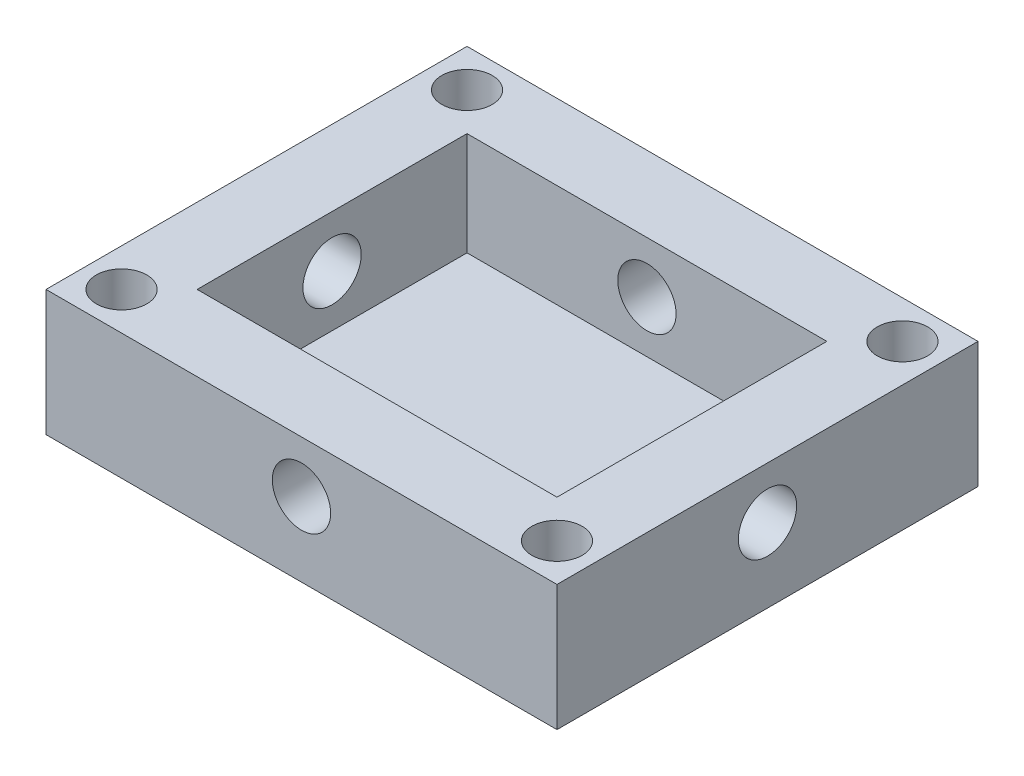
ISO-10303-21;
HEADER;
FILE_DESCRIPTION(('STEP AP214'),'2;1');
FILE_NAME('part.step','',(''),(''),'','','');
FILE_SCHEMA(('AUTOMOTIVE_DESIGN { 1 0 10303 214 1 1 1 1 }'));
ENDSEC;
DATA;
#1=APPLICATION_CONTEXT('core data for automotive mechanical design processes');
#2=APPLICATION_PROTOCOL_DEFINITION('international standard','automotive_design',2000,#1);
#3=PRODUCT_CONTEXT('',#1,'mechanical');
#4=PRODUCT('Part','Part','',(#3));
#5=PRODUCT_RELATED_PRODUCT_CATEGORY('part','',(#4));
#6=PRODUCT_DEFINITION_FORMATION('','',#4);
#7=PRODUCT_DEFINITION_CONTEXT('part definition',#1,'design');
#8=PRODUCT_DEFINITION('design','',#6,#7);
#9=PRODUCT_DEFINITION_SHAPE('','',#8);
#10=(LENGTH_UNIT() NAMED_UNIT(*) SI_UNIT(.MILLI.,.METRE.));
#11=(NAMED_UNIT(*) PLANE_ANGLE_UNIT() SI_UNIT($,.RADIAN.));
#12=(NAMED_UNIT(*) SI_UNIT($,.STERADIAN.) SOLID_ANGLE_UNIT());
#13=UNCERTAINTY_MEASURE_WITH_UNIT(LENGTH_MEASURE(1.E-05),#10,'distance_accuracy_value','');
#14=(GEOMETRIC_REPRESENTATION_CONTEXT(3) GLOBAL_UNCERTAINTY_ASSIGNED_CONTEXT((#13)) GLOBAL_UNIT_ASSIGNED_CONTEXT((#10,
#11,#12)) REPRESENTATION_CONTEXT('',''));
#15=CARTESIAN_POINT('',(0.,0.,0.));
#16=DIRECTION('',(0.,0.,1.));
#17=DIRECTION('',(1.,0.,0.));
#18=AXIS2_PLACEMENT_3D('',#15,#16,#17);
#19=CARTESIAN_POINT('',(0.,7.2898,0.));
#20=DIRECTION('',(0.,-1.,0.));
#21=DIRECTION('',(0.,0.,-1.));
#22=AXIS2_PLACEMENT_3D('',#19,#20,#21);
#23=PLANE('',#22);
#24=CARTESIAN_POINT('',(-15.367,7.2898,12.192));
#25=DIRECTION('',(0.,1.,0.));
#26=DIRECTION('',(0.,0.,1.));
#27=AXIS2_PLACEMENT_3D('',#24,#25,#26);
#28=CIRCLE('',#27,1.778);
#29=CARTESIAN_POINT('',(-15.367,7.2898,13.97));
#30=VERTEX_POINT('',#29);
#31=EDGE_CURVE('E198',#30,#30,#28,.T.);
#32=ORIENTED_EDGE('',*,*,#31,.F.);
#33=EDGE_LOOP('',(#32));
#34=FACE_BOUND('',#33,.T.);
#35=CARTESIAN_POINT('',(15.367,7.2898,12.192));
#36=DIRECTION('',(0.,1.,0.));
#37=DIRECTION('',(0.,0.,1.));
#38=AXIS2_PLACEMENT_3D('',#35,#36,#37);
#39=CIRCLE('',#38,1.778);
#40=CARTESIAN_POINT('',(15.367,7.2898,13.97));
#41=VERTEX_POINT('',#40);
#42=EDGE_CURVE('E202',#41,#41,#39,.T.);
#43=ORIENTED_EDGE('',*,*,#42,.F.);
#44=EDGE_LOOP('',(#43));
#45=FACE_BOUND('',#44,.T.);
#46=CARTESIAN_POINT('',(15.367,7.2898,-12.192));
#47=DIRECTION('',(0.,1.,0.));
#48=DIRECTION('',(0.,0.,1.));
#49=AXIS2_PLACEMENT_3D('',#46,#47,#48);
#50=CIRCLE('',#49,1.778);
#51=CARTESIAN_POINT('',(15.367,7.2898,-10.414));
#52=VERTEX_POINT('',#51);
#53=EDGE_CURVE('E199',#52,#52,#50,.T.);
#54=ORIENTED_EDGE('',*,*,#53,.F.);
#55=EDGE_LOOP('',(#54));
#56=FACE_BOUND('',#55,.T.);
#57=CARTESIAN_POINT('',(-15.367,7.2898,-12.192));
#58=DIRECTION('',(0.,1.,0.));
#59=DIRECTION('',(0.,0.,1.));
#60=AXIS2_PLACEMENT_3D('',#57,#58,#59);
#61=CIRCLE('',#60,1.778);
#62=CARTESIAN_POINT('',(-15.367,7.2898,-10.414));
#63=VERTEX_POINT('',#62);
#64=EDGE_CURVE('E130',#63,#63,#61,.T.);
#65=ORIENTED_EDGE('',*,*,#64,.F.);
#66=EDGE_LOOP('',(#65));
#67=FACE_BOUND('',#66,.T.);
#68=DIRECTION('',(0.,0.,1.));
#69=VECTOR('',#68,1.);
#70=CARTESIAN_POINT('',(-18.034,7.2898,14.859));
#71=LINE('',#70,#69);
#72=CARTESIAN_POINT('',(-18.034,7.2898,-14.859));
#73=VERTEX_POINT('',#72);
#74=CARTESIAN_POINT('',(-18.034,7.2898,14.859));
#75=VERTEX_POINT('',#74);
#76=EDGE_CURVE('E160',#73,#75,#71,.T.);
#77=ORIENTED_EDGE('',*,*,#76,.T.);
#78=DIRECTION('',(1.,0.,0.));
#79=VECTOR('',#78,1.);
#80=CARTESIAN_POINT('',(-18.034,7.2898,14.859));
#81=LINE('',#80,#79);
#82=CARTESIAN_POINT('',(18.034,7.2898,14.859));
#83=VERTEX_POINT('',#82);
#84=EDGE_CURVE('E163',#75,#83,#81,.T.);
#85=ORIENTED_EDGE('',*,*,#84,.T.);
#86=DIRECTION('',(0.,0.,-1.));
#87=VECTOR('',#86,1.);
#88=CARTESIAN_POINT('',(18.034,7.2898,14.859));
#89=LINE('',#88,#87);
#90=CARTESIAN_POINT('',(18.034,7.2898,-14.859));
#91=VERTEX_POINT('',#90);
#92=EDGE_CURVE('E107',#83,#91,#89,.T.);
#93=ORIENTED_EDGE('',*,*,#92,.T.);
#94=DIRECTION('',(-1.,0.,0.));
#95=VECTOR('',#94,1.);
#96=CARTESIAN_POINT('',(-18.034,7.2898,-14.859));
#97=LINE('',#96,#95);
#98=EDGE_CURVE('E166',#91,#73,#97,.T.);
#99=ORIENTED_EDGE('',*,*,#98,.T.);
#100=EDGE_LOOP('',(#77,#85,#93,#99));
#101=FACE_BOUND('',#100,.T.);
#102=DIRECTION('',(0.,0.,-1.));
#103=VECTOR('',#102,1.);
#104=CARTESIAN_POINT('',(12.7,7.2898,9.525));
#105=LINE('',#104,#103);
#106=CARTESIAN_POINT('',(12.7,7.2898,9.525));
#107=VERTEX_POINT('',#106);
#108=CARTESIAN_POINT('',(12.7,7.2898,-9.525));
#109=VERTEX_POINT('',#108);
#110=EDGE_CURVE('E135',#107,#109,#105,.T.);
#111=ORIENTED_EDGE('',*,*,#110,.F.);
#112=DIRECTION('',(1.,0.,0.));
#113=VECTOR('',#112,1.);
#114=CARTESIAN_POINT('',(-12.7,7.2898,9.525));
#115=LINE('',#114,#113);
#116=CARTESIAN_POINT('',(-12.7,7.2898,9.525));
#117=VERTEX_POINT('',#116);
#118=EDGE_CURVE('E142',#117,#107,#115,.T.);
#119=ORIENTED_EDGE('',*,*,#118,.F.);
#120=DIRECTION('',(0.,0.,1.));
#121=VECTOR('',#120,1.);
#122=CARTESIAN_POINT('',(-12.7,7.2898,9.525));
#123=LINE('',#122,#121);
#124=CARTESIAN_POINT('',(-12.7,7.2898,-9.525));
#125=VERTEX_POINT('',#124);
#126=EDGE_CURVE('E140',#125,#117,#123,.T.);
#127=ORIENTED_EDGE('',*,*,#126,.F.);
#128=DIRECTION('',(-1.,0.,0.));
#129=VECTOR('',#128,1.);
#130=CARTESIAN_POINT('',(-12.7,7.2898,-9.525));
#131=LINE('',#130,#129);
#132=EDGE_CURVE('E137',#109,#125,#131,.T.);
#133=ORIENTED_EDGE('',*,*,#132,.F.);
#134=EDGE_LOOP('',(#111,#119,#127,#133));
#135=FACE_BOUND('',#134,.T.);
#136=ADVANCED_FACE('F33',(#34,#45,#56,#67,#101,#135),#23,.F.);
#137=CARTESIAN_POINT('',(-18.034,7.2898,14.859));
#138=DIRECTION('',(1.,0.,0.));
#139=DIRECTION('',(0.,0.,-1.));
#140=AXIS2_PLACEMENT_3D('',#137,#138,#139);
#141=PLANE('',#140);
#142=CARTESIAN_POINT('',(-18.034,3.6449,0.));
#143=DIRECTION('',(1.,0.,0.));
#144=DIRECTION('',(0.,0.,-1.));
#145=AXIS2_PLACEMENT_3D('',#142,#143,#144);
#146=CIRCLE('',#145,2.0574);
#147=CARTESIAN_POINT('',(-18.034,3.6449,-2.0574));
#148=VERTEX_POINT('',#147);
#149=EDGE_CURVE('E181',#148,#148,#146,.T.);
#150=ORIENTED_EDGE('',*,*,#149,.T.);
#151=EDGE_LOOP('',(#150));
#152=FACE_BOUND('',#151,.T.);
#153=DIRECTION('',(0.,-1.,0.));
#154=VECTOR('',#153,1.);
#155=CARTESIAN_POINT('',(-18.034,7.2898,-14.859));
#156=LINE('',#155,#154);
#157=CARTESIAN_POINT('',(-18.034,-1.5875,-14.859));
#158=VERTEX_POINT('',#157);
#159=EDGE_CURVE('E168',#73,#158,#156,.T.);
#160=ORIENTED_EDGE('',*,*,#159,.T.);
#161=DIRECTION('',(0.,0.,-1.));
#162=VECTOR('',#161,1.);
#163=CARTESIAN_POINT('',(-18.034,-1.5875,-14.859));
#164=LINE('',#163,#162);
#165=CARTESIAN_POINT('',(-18.034,-1.5875,14.859));
#166=VERTEX_POINT('',#165);
#167=EDGE_CURVE('E118',#166,#158,#164,.T.);
#168=ORIENTED_EDGE('',*,*,#167,.F.);
#169=DIRECTION('',(0.,-1.,0.));
#170=VECTOR('',#169,1.);
#171=CARTESIAN_POINT('',(-18.034,7.2898,14.859));
#172=LINE('',#171,#170);
#173=EDGE_CURVE('E11',#75,#166,#172,.T.);
#174=ORIENTED_EDGE('',*,*,#173,.F.);
#175=ORIENTED_EDGE('',*,*,#76,.F.);
#176=EDGE_LOOP('',(#160,#168,#174,#175));
#177=FACE_BOUND('',#176,.T.);
#178=ADVANCED_FACE('F35',(#152,#177),#141,.F.);
#179=CARTESIAN_POINT('',(-18.034,7.2898,14.859));
#180=DIRECTION('',(0.,0.,-1.));
#181=DIRECTION('',(-1.,0.,0.));
#182=AXIS2_PLACEMENT_3D('',#179,#180,#181);
#183=PLANE('',#182);
#184=CARTESIAN_POINT('',(0.,3.6449,14.859));
#185=DIRECTION('',(0.,0.,1.));
#186=DIRECTION('',(1.,0.,0.));
#187=AXIS2_PLACEMENT_3D('',#184,#185,#186);
#188=CIRCLE('',#187,2.0574);
#189=CARTESIAN_POINT('',(2.0574,3.6449,14.859));
#190=VERTEX_POINT('',#189);
#191=EDGE_CURVE('E266',#190,#190,#188,.T.);
#192=ORIENTED_EDGE('',*,*,#191,.F.);
#193=EDGE_LOOP('',(#192));
#194=FACE_BOUND('',#193,.T.);
#195=ORIENTED_EDGE('',*,*,#173,.T.);
#196=DIRECTION('',(-1.,0.,0.));
#197=VECTOR('',#196,1.);
#198=CARTESIAN_POINT('',(-18.034,-1.5875,14.859));
#199=LINE('',#198,#197);
#200=CARTESIAN_POINT('',(18.034,-1.5875,14.859));
#201=VERTEX_POINT('',#200);
#202=EDGE_CURVE('E112',#201,#166,#199,.T.);
#203=ORIENTED_EDGE('',*,*,#202,.F.);
#204=DIRECTION('',(0.,-1.,0.));
#205=VECTOR('',#204,1.);
#206=CARTESIAN_POINT('',(18.034,7.2898,14.859));
#207=LINE('',#206,#205);
#208=EDGE_CURVE('E42',#83,#201,#207,.T.);
#209=ORIENTED_EDGE('',*,*,#208,.F.);
#210=ORIENTED_EDGE('',*,*,#84,.F.);
#211=EDGE_LOOP('',(#195,#203,#209,#210));
#212=FACE_BOUND('',#211,.T.);
#213=ADVANCED_FACE('F113',(#194,#212),#183,.F.);
#214=CARTESIAN_POINT('',(18.034,7.2898,14.859));
#215=DIRECTION('',(-1.,0.,0.));
#216=DIRECTION('',(0.,0.,1.));
#217=AXIS2_PLACEMENT_3D('',#214,#215,#216);
#218=PLANE('',#217);
#219=CARTESIAN_POINT('',(18.034,3.6449,0.));
#220=DIRECTION('',(-1.,0.,0.));
#221=DIRECTION('',(0.,0.,1.));
#222=AXIS2_PLACEMENT_3D('',#219,#220,#221);
#223=CIRCLE('',#222,2.0574);
#224=CARTESIAN_POINT('',(18.034,3.6449,2.0574));
#225=VERTEX_POINT('',#224);
#226=EDGE_CURVE('E185',#225,#225,#223,.T.);
#227=ORIENTED_EDGE('',*,*,#226,.T.);
#228=EDGE_LOOP('',(#227));
#229=FACE_BOUND('',#228,.T.);
#230=ORIENTED_EDGE('',*,*,#208,.T.);
#231=DIRECTION('',(0.,0.,1.));
#232=VECTOR('',#231,1.);
#233=CARTESIAN_POINT('',(18.034,-1.5875,-14.859));
#234=LINE('',#233,#232);
#235=CARTESIAN_POINT('',(18.034,-1.5875,-14.859));
#236=VERTEX_POINT('',#235);
#237=EDGE_CURVE('E106',#236,#201,#234,.T.);
#238=ORIENTED_EDGE('',*,*,#237,.F.);
#239=DIRECTION('',(0.,-1.,0.));
#240=VECTOR('',#239,1.);
#241=CARTESIAN_POINT('',(18.034,7.2898,-14.859));
#242=LINE('',#241,#240);
#243=EDGE_CURVE('E109',#91,#236,#242,.T.);
#244=ORIENTED_EDGE('',*,*,#243,.F.);
#245=ORIENTED_EDGE('',*,*,#92,.F.);
#246=EDGE_LOOP('',(#230,#238,#244,#245));
#247=FACE_BOUND('',#246,.T.);
#248=ADVANCED_FACE('F103',(#229,#247),#218,.F.);
#249=CARTESIAN_POINT('',(-18.034,7.2898,-14.859));
#250=DIRECTION('',(0.,0.,1.));
#251=DIRECTION('',(1.,0.,0.));
#252=AXIS2_PLACEMENT_3D('',#249,#250,#251);
#253=PLANE('',#252);
#254=CARTESIAN_POINT('',(0.,3.6449,-14.859));
#255=DIRECTION('',(0.,0.,1.));
#256=DIRECTION('',(1.,0.,0.));
#257=AXIS2_PLACEMENT_3D('',#254,#255,#256);
#258=CIRCLE('',#257,2.0574);
#259=CARTESIAN_POINT('',(2.0574,3.6449,-14.859));
#260=VERTEX_POINT('',#259);
#261=EDGE_CURVE('E268',#260,#260,#258,.T.);
#262=ORIENTED_EDGE('',*,*,#261,.T.);
#263=EDGE_LOOP('',(#262));
#264=FACE_BOUND('',#263,.T.);
#265=ORIENTED_EDGE('',*,*,#243,.T.);
#266=DIRECTION('',(1.,0.,0.));
#267=VECTOR('',#266,1.);
#268=CARTESIAN_POINT('',(-18.034,-1.5875,-14.859));
#269=LINE('',#268,#267);
#270=EDGE_CURVE('E123',#158,#236,#269,.T.);
#271=ORIENTED_EDGE('',*,*,#270,.F.);
#272=ORIENTED_EDGE('',*,*,#159,.F.);
#273=ORIENTED_EDGE('',*,*,#98,.F.);
#274=EDGE_LOOP('',(#265,#271,#272,#273));
#275=FACE_BOUND('',#274,.T.);
#276=ADVANCED_FACE('F251',(#264,#275),#253,.F.);
#277=CARTESIAN_POINT('',(12.7,7.2898,9.525));
#278=DIRECTION('',(-1.,0.,0.));
#279=DIRECTION('',(0.,0.,1.));
#280=AXIS2_PLACEMENT_3D('',#277,#278,#279);
#281=PLANE('',#280);
#282=CARTESIAN_POINT('',(12.7,3.6449,0.));
#283=DIRECTION('',(-1.,0.,0.));
#284=DIRECTION('',(0.,0.,1.));
#285=AXIS2_PLACEMENT_3D('',#282,#283,#284);
#286=CIRCLE('',#285,2.0574);
#287=CARTESIAN_POINT('',(12.7,3.6449,2.0574));
#288=VERTEX_POINT('',#287);
#289=EDGE_CURVE('E180',#288,#288,#286,.T.);
#290=ORIENTED_EDGE('',*,*,#289,.F.);
#291=EDGE_LOOP('',(#290));
#292=FACE_BOUND('',#291,.T.);
#293=DIRECTION('',(0.,0.,-1.));
#294=VECTOR('',#293,1.);
#295=CARTESIAN_POINT('',(12.7,0.,9.525));
#296=LINE('',#295,#294);
#297=CARTESIAN_POINT('',(12.7,0.,9.525));
#298=VERTEX_POINT('',#297);
#299=CARTESIAN_POINT('',(12.7,0.,-9.525));
#300=VERTEX_POINT('',#299);
#301=EDGE_CURVE('E58',#298,#300,#296,.T.);
#302=ORIENTED_EDGE('',*,*,#301,.F.);
#303=DIRECTION('',(0.,-1.,0.));
#304=VECTOR('',#303,1.);
#305=CARTESIAN_POINT('',(12.7,7.2898,9.525));
#306=LINE('',#305,#304);
#307=EDGE_CURVE('E144',#107,#298,#306,.T.);
#308=ORIENTED_EDGE('',*,*,#307,.F.);
#309=ORIENTED_EDGE('',*,*,#110,.T.);
#310=DIRECTION('',(0.,-1.,0.));
#311=VECTOR('',#310,1.);
#312=CARTESIAN_POINT('',(12.7,7.2898,-9.525));
#313=LINE('',#312,#311);
#314=EDGE_CURVE('E158',#109,#300,#313,.T.);
#315=ORIENTED_EDGE('',*,*,#314,.T.);
#316=EDGE_LOOP('',(#302,#308,#309,#315));
#317=FACE_BOUND('',#316,.T.);
#318=ADVANCED_FACE('F227',(#292,#317),#281,.T.);
#319=CARTESIAN_POINT('',(-12.7,7.2898,-9.525));
#320=DIRECTION('',(0.,0.,1.));
#321=DIRECTION('',(1.,0.,0.));
#322=AXIS2_PLACEMENT_3D('',#319,#320,#321);
#323=PLANE('',#322);
#324=CARTESIAN_POINT('',(0.,3.6449,-9.525));
#325=DIRECTION('',(0.,0.,1.));
#326=DIRECTION('',(1.,0.,0.));
#327=AXIS2_PLACEMENT_3D('',#324,#325,#326);
#328=CIRCLE('',#327,2.0574);
#329=CARTESIAN_POINT('',(2.0574,3.6449,-9.525));
#330=VERTEX_POINT('',#329);
#331=EDGE_CURVE('E188',#330,#330,#328,.T.);
#332=ORIENTED_EDGE('',*,*,#331,.F.);
#333=EDGE_LOOP('',(#332));
#334=FACE_BOUND('',#333,.T.);
#335=DIRECTION('',(-1.,0.,0.));
#336=VECTOR('',#335,1.);
#337=CARTESIAN_POINT('',(-12.7,0.,-9.525));
#338=LINE('',#337,#336);
#339=CARTESIAN_POINT('',(-12.7,0.,-9.525));
#340=VERTEX_POINT('',#339);
#341=EDGE_CURVE('E146',#300,#340,#338,.T.);
#342=ORIENTED_EDGE('',*,*,#341,.F.);
#343=ORIENTED_EDGE('',*,*,#314,.F.);
#344=ORIENTED_EDGE('',*,*,#132,.T.);
#345=DIRECTION('',(0.,-1.,0.));
#346=VECTOR('',#345,1.);
#347=CARTESIAN_POINT('',(-12.7,7.2898,-9.525));
#348=LINE('',#347,#346);
#349=EDGE_CURVE('E156',#125,#340,#348,.T.);
#350=ORIENTED_EDGE('',*,*,#349,.T.);
#351=EDGE_LOOP('',(#342,#343,#344,#350));
#352=FACE_BOUND('',#351,.T.);
#353=ADVANCED_FACE('F229',(#334,#352),#323,.T.);
#354=CARTESIAN_POINT('',(-12.7,7.2898,9.525));
#355=DIRECTION('',(1.,0.,0.));
#356=DIRECTION('',(0.,0.,-1.));
#357=AXIS2_PLACEMENT_3D('',#354,#355,#356);
#358=PLANE('',#357);
#359=CARTESIAN_POINT('',(-12.7,3.6449,0.));
#360=DIRECTION('',(1.,0.,0.));
#361=DIRECTION('',(0.,0.,-1.));
#362=AXIS2_PLACEMENT_3D('',#359,#360,#361);
#363=CIRCLE('',#362,2.0574);
#364=CARTESIAN_POINT('',(-12.7,3.6449,-2.0574));
#365=VERTEX_POINT('',#364);
#366=EDGE_CURVE('E178',#365,#365,#363,.T.);
#367=ORIENTED_EDGE('',*,*,#366,.F.);
#368=EDGE_LOOP('',(#367));
#369=FACE_BOUND('',#368,.T.);
#370=DIRECTION('',(0.,0.,1.));
#371=VECTOR('',#370,1.);
#372=CARTESIAN_POINT('',(-12.7,0.,9.525));
#373=LINE('',#372,#371);
#374=CARTESIAN_POINT('',(-12.7,0.,9.525));
#375=VERTEX_POINT('',#374);
#376=EDGE_CURVE('E149',#340,#375,#373,.T.);
#377=ORIENTED_EDGE('',*,*,#376,.F.);
#378=ORIENTED_EDGE('',*,*,#349,.F.);
#379=ORIENTED_EDGE('',*,*,#126,.T.);
#380=DIRECTION('',(0.,-1.,0.));
#381=VECTOR('',#380,1.);
#382=CARTESIAN_POINT('',(-12.7,7.2898,9.525));
#383=LINE('',#382,#381);
#384=EDGE_CURVE('E50',#117,#375,#383,.T.);
#385=ORIENTED_EDGE('',*,*,#384,.T.);
#386=EDGE_LOOP('',(#377,#378,#379,#385));
#387=FACE_BOUND('',#386,.T.);
#388=ADVANCED_FACE('F236',(#369,#387),#358,.T.);
#389=CARTESIAN_POINT('',(-12.7,7.2898,9.525));
#390=DIRECTION('',(0.,0.,-1.));
#391=DIRECTION('',(-1.,0.,0.));
#392=AXIS2_PLACEMENT_3D('',#389,#390,#391);
#393=PLANE('',#392);
#394=CARTESIAN_POINT('',(0.,3.6449,9.525));
#395=DIRECTION('',(0.,0.,-1.));
#396=DIRECTION('',(-1.,0.,0.));
#397=AXIS2_PLACEMENT_3D('',#394,#395,#396);
#398=CIRCLE('',#397,2.0574);
#399=CARTESIAN_POINT('',(-2.0574,3.6449,9.525));
#400=VERTEX_POINT('',#399);
#401=EDGE_CURVE('E37',#400,#400,#398,.T.);
#402=ORIENTED_EDGE('',*,*,#401,.F.);
#403=EDGE_LOOP('',(#402));
#404=FACE_BOUND('',#403,.T.);
#405=DIRECTION('',(1.,0.,0.));
#406=VECTOR('',#405,1.);
#407=CARTESIAN_POINT('',(-12.7,0.,9.525));
#408=LINE('',#407,#406);
#409=EDGE_CURVE('E138',#375,#298,#408,.T.);
#410=ORIENTED_EDGE('',*,*,#409,.F.);
#411=ORIENTED_EDGE('',*,*,#384,.F.);
#412=ORIENTED_EDGE('',*,*,#118,.T.);
#413=ORIENTED_EDGE('',*,*,#307,.T.);
#414=EDGE_LOOP('',(#410,#411,#412,#413));
#415=FACE_BOUND('',#414,.T.);
#416=ADVANCED_FACE('F234',(#404,#415),#393,.T.);
#417=CARTESIAN_POINT('',(0.,0.,0.));
#418=DIRECTION('',(0.,1.,0.));
#419=DIRECTION('',(0.,0.,1.));
#420=AXIS2_PLACEMENT_3D('',#417,#418,#419);
#421=PLANE('',#420);
#422=ORIENTED_EDGE('',*,*,#376,.T.);
#423=ORIENTED_EDGE('',*,*,#409,.T.);
#424=ORIENTED_EDGE('',*,*,#301,.T.);
#425=ORIENTED_EDGE('',*,*,#341,.T.);
#426=EDGE_LOOP('',(#422,#423,#424,#425));
#427=FACE_BOUND('',#426,.T.);
#428=ADVANCED_FACE('F233',(#427),#421,.T.);
#429=CARTESIAN_POINT('',(0.,-1.5875,0.));
#430=DIRECTION('',(0.,1.,0.));
#431=DIRECTION('',(0.,0.,1.));
#432=AXIS2_PLACEMENT_3D('',#429,#430,#431);
#433=PLANE('',#432);
#434=CARTESIAN_POINT('',(-15.367,-1.5875,12.192));
#435=DIRECTION('',(0.,1.,0.));
#436=DIRECTION('',(0.,0.,1.));
#437=AXIS2_PLACEMENT_3D('',#434,#435,#436);
#438=CIRCLE('',#437,1.778);
#439=CARTESIAN_POINT('',(-15.367,-1.5875,13.97));
#440=VERTEX_POINT('',#439);
#441=EDGE_CURVE('E124',#440,#440,#438,.T.);
#442=ORIENTED_EDGE('',*,*,#441,.T.);
#443=EDGE_LOOP('',(#442));
#444=FACE_BOUND('',#443,.T.);
#445=CARTESIAN_POINT('',(15.367,-1.5875,12.192));
#446=DIRECTION('',(0.,1.,0.));
#447=DIRECTION('',(0.,0.,1.));
#448=AXIS2_PLACEMENT_3D('',#445,#446,#447);
#449=CIRCLE('',#448,1.778);
#450=CARTESIAN_POINT('',(15.367,-1.5875,13.97));
#451=VERTEX_POINT('',#450);
#452=EDGE_CURVE('E127',#451,#451,#449,.T.);
#453=ORIENTED_EDGE('',*,*,#452,.T.);
#454=EDGE_LOOP('',(#453));
#455=FACE_BOUND('',#454,.T.);
#456=CARTESIAN_POINT('',(15.367,-1.5875,-12.192));
#457=DIRECTION('',(0.,1.,0.));
#458=DIRECTION('',(0.,0.,1.));
#459=AXIS2_PLACEMENT_3D('',#456,#457,#458);
#460=CIRCLE('',#459,1.778);
#461=CARTESIAN_POINT('',(15.367,-1.5875,-10.414));
#462=VERTEX_POINT('',#461);
#463=EDGE_CURVE('E174',#462,#462,#460,.T.);
#464=ORIENTED_EDGE('',*,*,#463,.T.);
#465=EDGE_LOOP('',(#464));
#466=FACE_BOUND('',#465,.T.);
#467=CARTESIAN_POINT('',(-15.367,-1.5875,-12.192));
#468=DIRECTION('',(0.,1.,0.));
#469=DIRECTION('',(0.,0.,1.));
#470=AXIS2_PLACEMENT_3D('',#467,#468,#469);
#471=CIRCLE('',#470,1.778);
#472=CARTESIAN_POINT('',(-15.367,-1.5875,-10.414));
#473=VERTEX_POINT('',#472);
#474=EDGE_CURVE('E171',#473,#473,#471,.T.);
#475=ORIENTED_EDGE('',*,*,#474,.T.);
#476=EDGE_LOOP('',(#475));
#477=FACE_BOUND('',#476,.T.);
#478=ORIENTED_EDGE('',*,*,#237,.T.);
#479=ORIENTED_EDGE('',*,*,#202,.T.);
#480=ORIENTED_EDGE('',*,*,#167,.T.);
#481=ORIENTED_EDGE('',*,*,#270,.T.);
#482=EDGE_LOOP('',(#478,#479,#480,#481));
#483=FACE_BOUND('',#482,.T.);
#484=ADVANCED_FACE('F121',(#444,#455,#466,#477,#483),#433,.F.);
#485=CARTESIAN_POINT('',(-15.367,-2.2352,-12.192));
#486=DIRECTION('',(0.,1.,0.));
#487=DIRECTION('',(0.,0.,1.));
#488=AXIS2_PLACEMENT_3D('',#485,#486,#487);
#489=CYLINDRICAL_SURFACE('',#488,1.778);
#490=CARTESIAN_POINT('',(-15.367,7.2898,-10.414));
#491=CARTESIAN_POINT('',(-15.367,7.197328125,-10.414));
#492=CARTESIAN_POINT('',(-15.367,7.10485625,-10.414));
#493=CARTESIAN_POINT('',(-15.367,6.9199125,-10.414));
#494=CARTESIAN_POINT('',(-15.367,6.827440625,-10.414));
#495=CARTESIAN_POINT('',(-15.367,6.642496875,-10.414));
#496=CARTESIAN_POINT('',(-15.367,6.550025,-10.414));
#497=CARTESIAN_POINT('',(-15.367,6.36508125,-10.414));
#498=CARTESIAN_POINT('',(-15.367,6.272609375,-10.414));
#499=CARTESIAN_POINT('',(-15.367,6.087665625,-10.414));
#500=CARTESIAN_POINT('',(-15.367,5.99519375,-10.414));
#501=CARTESIAN_POINT('',(-15.367,5.81025,-10.414));
#502=CARTESIAN_POINT('',(-15.367,5.717778125,-10.414));
#503=CARTESIAN_POINT('',(-15.367,5.532834375,-10.414));
#504=CARTESIAN_POINT('',(-15.367,5.4403625,-10.414));
#505=CARTESIAN_POINT('',(-15.367,5.25541875,-10.414));
#506=CARTESIAN_POINT('',(-15.367,5.162946875,-10.414));
#507=CARTESIAN_POINT('',(-15.367,4.978003125,-10.414));
#508=CARTESIAN_POINT('',(-15.367,4.88553125,-10.414));
#509=CARTESIAN_POINT('',(-15.367,4.7005875,-10.414));
#510=CARTESIAN_POINT('',(-15.367,4.608115625,-10.414));
#511=CARTESIAN_POINT('',(-15.367,4.423171875,-10.414));
#512=CARTESIAN_POINT('',(-15.367,4.3307,-10.414));
#513=CARTESIAN_POINT('',(-15.367,4.14575625,-10.414));
#514=CARTESIAN_POINT('',(-15.367,4.053284375,-10.414));
#515=CARTESIAN_POINT('',(-15.367,3.868340625,-10.414));
#516=CARTESIAN_POINT('',(-15.367,3.77586875,-10.414));
#517=CARTESIAN_POINT('',(-15.367,3.590925,-10.414));
#518=CARTESIAN_POINT('',(-15.367,3.498453125,-10.414));
#519=CARTESIAN_POINT('',(-15.367,3.313509375,-10.414));
#520=CARTESIAN_POINT('',(-15.367,3.2210375,-10.414));
#521=CARTESIAN_POINT('',(-15.367,3.03609375,-10.414));
#522=CARTESIAN_POINT('',(-15.367,2.943621875,-10.414));
#523=CARTESIAN_POINT('',(-15.367,2.758678125,-10.414));
#524=CARTESIAN_POINT('',(-15.367,2.66620625,-10.414));
#525=CARTESIAN_POINT('',(-15.367,2.4812625,-10.414));
#526=CARTESIAN_POINT('',(-15.367,2.388790625,-10.414));
#527=CARTESIAN_POINT('',(-15.367,2.203846875,-10.414));
#528=CARTESIAN_POINT('',(-15.367,2.111375,-10.414));
#529=CARTESIAN_POINT('',(-15.367,1.92643125,-10.414));
#530=CARTESIAN_POINT('',(-15.367,1.833959375,-10.414));
#531=CARTESIAN_POINT('',(-15.367,1.649015625,-10.414));
#532=CARTESIAN_POINT('',(-15.367,1.55654375,-10.414));
#533=CARTESIAN_POINT('',(-15.367,1.3716,-10.414));
#534=CARTESIAN_POINT('',(-15.367,1.279128125,-10.414));
#535=CARTESIAN_POINT('',(-15.367,1.094184375,-10.414));
#536=CARTESIAN_POINT('',(-15.367,1.0017125,-10.414));
#537=CARTESIAN_POINT('',(-15.367,0.81676875,-10.414));
#538=CARTESIAN_POINT('',(-15.367,0.724296875,-10.414));
#539=CARTESIAN_POINT('',(-15.367,0.539353125,-10.414));
#540=CARTESIAN_POINT('',(-15.367,0.44688125,-10.414));
#541=CARTESIAN_POINT('',(-15.367,0.2619375,-10.414));
#542=CARTESIAN_POINT('',(-15.367,0.169465625,-10.414));
#543=CARTESIAN_POINT('',(-15.367,-0.015478125,-10.414));
#544=CARTESIAN_POINT('',(-15.367,-0.10795,-10.414));
#545=CARTESIAN_POINT('',(-15.367,-0.29289375,-10.414));
#546=CARTESIAN_POINT('',(-15.367,-0.385365625,-10.414));
#547=CARTESIAN_POINT('',(-15.367,-0.570309375,-10.414));
#548=CARTESIAN_POINT('',(-15.367,-0.662781250000001,-10.414));
#549=CARTESIAN_POINT('',(-15.367,-0.847725000000001,-10.414));
#550=CARTESIAN_POINT('',(-15.367,-0.940196875,-10.414));
#551=CARTESIAN_POINT('',(-15.367,-1.125140625,-10.414));
#552=CARTESIAN_POINT('',(-15.367,-1.2176125,-10.414));
#553=CARTESIAN_POINT('',(-15.367,-1.40255625,-10.414));
#554=CARTESIAN_POINT('',(-15.367,-1.495028125,-10.414));
#555=CARTESIAN_POINT('',(-15.367,-1.5875,-10.414));
#556=B_SPLINE_CURVE_WITH_KNOTS('',3,(#490,#491,#492,#493,#494,#495,#496,#497,#498,#499,#500,
#501,#502,#503,#504,#505,#506,#507,#508,#509,#510,#511,#512,#513,#514,#515,#516,#517,#518,#519,
#520,#521,#522,#523,#524,#525,#526,#527,#528,#529,#530,#531,#532,#533,#534,#535,#536,#537,#538,
#539,#540,#541,#542,#543,#544,#545,#546,#547,#548,#549,#550,#551,#552,#553,#554,#555),
.UNSPECIFIED.,.F.,.F.,(4,2,2,2,2,2,2,2,2,2,2,2,2,2,2,2,2,2,2,2,2,2,2,2,2,2,2,2,2,2,2,2,4),(0.,
0.277415624999999,0.55483125,0.832246875,1.1096625,1.387078125,1.66449375,1.941909375,2.219325,
2.496740625,2.77415625,3.051571875,3.3289875,3.606403125,3.88381875,4.161234375,4.43865,
4.716065625,4.99348125,5.270896875,5.5483125,5.825728125,6.10314375,6.380559375,6.657975,
6.935390625,7.21280625,7.490221875,7.7676375,8.045053125,8.32246875,8.599884375,8.8773),.UNSPECIFIED.);
#557=EDGE_CURVE('BSEAM294',#63,#473,#556,.T.);
#558=ORIENTED_EDGE('',*,*,#64,.T.);
#559=ORIENTED_EDGE('',*,*,#474,.F.);
#560=ORIENTED_EDGE('',*,*,#557,.T.);
#561=ORIENTED_EDGE('',*,*,#557,.F.);
#562=EDGE_LOOP('',(#558,#560,#559,#561));
#563=FACE_BOUND('',#562,.T.);
#564=ADVANCED_FACE('F294',(#563),#489,.F.);
#565=CARTESIAN_POINT('',(15.367,-2.2352,-12.192));
#566=DIRECTION('',(0.,1.,0.));
#567=DIRECTION('',(0.,0.,1.));
#568=AXIS2_PLACEMENT_3D('',#565,#566,#567);
#569=CYLINDRICAL_SURFACE('',#568,1.778);
#570=CARTESIAN_POINT('',(15.367,7.2898,-10.414));
#571=CARTESIAN_POINT('',(15.367,7.197328125,-10.414));
#572=CARTESIAN_POINT('',(15.367,7.10485625,-10.414));
#573=CARTESIAN_POINT('',(15.367,6.9199125,-10.414));
#574=CARTESIAN_POINT('',(15.367,6.827440625,-10.414));
#575=CARTESIAN_POINT('',(15.367,6.642496875,-10.414));
#576=CARTESIAN_POINT('',(15.367,6.550025,-10.414));
#577=CARTESIAN_POINT('',(15.367,6.36508125,-10.414));
#578=CARTESIAN_POINT('',(15.367,6.272609375,-10.414));
#579=CARTESIAN_POINT('',(15.367,6.087665625,-10.414));
#580=CARTESIAN_POINT('',(15.367,5.99519375,-10.414));
#581=CARTESIAN_POINT('',(15.367,5.81025,-10.414));
#582=CARTESIAN_POINT('',(15.367,5.717778125,-10.414));
#583=CARTESIAN_POINT('',(15.367,5.532834375,-10.414));
#584=CARTESIAN_POINT('',(15.367,5.4403625,-10.414));
#585=CARTESIAN_POINT('',(15.367,5.25541875,-10.414));
#586=CARTESIAN_POINT('',(15.367,5.162946875,-10.414));
#587=CARTESIAN_POINT('',(15.367,4.978003125,-10.414));
#588=CARTESIAN_POINT('',(15.367,4.88553125,-10.414));
#589=CARTESIAN_POINT('',(15.367,4.7005875,-10.414));
#590=CARTESIAN_POINT('',(15.367,4.608115625,-10.414));
#591=CARTESIAN_POINT('',(15.367,4.423171875,-10.414));
#592=CARTESIAN_POINT('',(15.367,4.3307,-10.414));
#593=CARTESIAN_POINT('',(15.367,4.14575625,-10.414));
#594=CARTESIAN_POINT('',(15.367,4.053284375,-10.414));
#595=CARTESIAN_POINT('',(15.367,3.868340625,-10.414));
#596=CARTESIAN_POINT('',(15.367,3.77586875,-10.414));
#597=CARTESIAN_POINT('',(15.367,3.590925,-10.414));
#598=CARTESIAN_POINT('',(15.367,3.498453125,-10.414));
#599=CARTESIAN_POINT('',(15.367,3.313509375,-10.414));
#600=CARTESIAN_POINT('',(15.367,3.2210375,-10.414));
#601=CARTESIAN_POINT('',(15.367,3.03609375,-10.414));
#602=CARTESIAN_POINT('',(15.367,2.943621875,-10.414));
#603=CARTESIAN_POINT('',(15.367,2.758678125,-10.414));
#604=CARTESIAN_POINT('',(15.367,2.66620625,-10.414));
#605=CARTESIAN_POINT('',(15.367,2.4812625,-10.414));
#606=CARTESIAN_POINT('',(15.367,2.388790625,-10.414));
#607=CARTESIAN_POINT('',(15.367,2.203846875,-10.414));
#608=CARTESIAN_POINT('',(15.367,2.111375,-10.414));
#609=CARTESIAN_POINT('',(15.367,1.92643125,-10.414));
#610=CARTESIAN_POINT('',(15.367,1.833959375,-10.414));
#611=CARTESIAN_POINT('',(15.367,1.649015625,-10.414));
#612=CARTESIAN_POINT('',(15.367,1.55654375,-10.414));
#613=CARTESIAN_POINT('',(15.367,1.3716,-10.414));
#614=CARTESIAN_POINT('',(15.367,1.279128125,-10.414));
#615=CARTESIAN_POINT('',(15.367,1.094184375,-10.414));
#616=CARTESIAN_POINT('',(15.367,1.0017125,-10.414));
#617=CARTESIAN_POINT('',(15.367,0.81676875,-10.414));
#618=CARTESIAN_POINT('',(15.367,0.724296875,-10.414));
#619=CARTESIAN_POINT('',(15.367,0.539353125,-10.414));
#620=CARTESIAN_POINT('',(15.367,0.44688125,-10.414));
#621=CARTESIAN_POINT('',(15.367,0.2619375,-10.414));
#622=CARTESIAN_POINT('',(15.367,0.169465625,-10.414));
#623=CARTESIAN_POINT('',(15.367,-0.015478125,-10.414));
#624=CARTESIAN_POINT('',(15.367,-0.10795,-10.414));
#625=CARTESIAN_POINT('',(15.367,-0.29289375,-10.414));
#626=CARTESIAN_POINT('',(15.367,-0.385365625,-10.414));
#627=CARTESIAN_POINT('',(15.367,-0.570309375,-10.414));
#628=CARTESIAN_POINT('',(15.367,-0.662781250000001,-10.414));
#629=CARTESIAN_POINT('',(15.367,-0.847725000000001,-10.414));
#630=CARTESIAN_POINT('',(15.367,-0.940196875,-10.414));
#631=CARTESIAN_POINT('',(15.367,-1.125140625,-10.414));
#632=CARTESIAN_POINT('',(15.367,-1.2176125,-10.414));
#633=CARTESIAN_POINT('',(15.367,-1.40255625,-10.414));
#634=CARTESIAN_POINT('',(15.367,-1.495028125,-10.414));
#635=CARTESIAN_POINT('',(15.367,-1.5875,-10.414));
#636=B_SPLINE_CURVE_WITH_KNOTS('',3,(#570,#571,#572,#573,#574,#575,#576,#577,#578,#579,#580,
#581,#582,#583,#584,#585,#586,#587,#588,#589,#590,#591,#592,#593,#594,#595,#596,#597,#598,#599,
#600,#601,#602,#603,#604,#605,#606,#607,#608,#609,#610,#611,#612,#613,#614,#615,#616,#617,#618,
#619,#620,#621,#622,#623,#624,#625,#626,#627,#628,#629,#630,#631,#632,#633,#634,#635),
.UNSPECIFIED.,.F.,.F.,(4,2,2,2,2,2,2,2,2,2,2,2,2,2,2,2,2,2,2,2,2,2,2,2,2,2,2,2,2,2,2,2,4),(0.,
0.277415624999999,0.55483125,0.832246875,1.1096625,1.387078125,1.66449375,1.941909375,2.219325,
2.496740625,2.77415625,3.051571875,3.3289875,3.606403125,3.88381875,4.161234375,4.43865,
4.716065625,4.99348125,5.270896875,5.5483125,5.825728125,6.10314375,6.380559375,6.657975,
6.935390625,7.21280625,7.490221875,7.7676375,8.045053125,8.32246875,8.599884375,8.8773),.UNSPECIFIED.);
#637=EDGE_CURVE('BSEAM290',#52,#462,#636,.T.);
#638=ORIENTED_EDGE('',*,*,#53,.T.);
#639=ORIENTED_EDGE('',*,*,#463,.F.);
#640=ORIENTED_EDGE('',*,*,#637,.T.);
#641=ORIENTED_EDGE('',*,*,#637,.F.);
#642=EDGE_LOOP('',(#638,#640,#639,#641));
#643=FACE_BOUND('',#642,.T.);
#644=ADVANCED_FACE('F290',(#643),#569,.F.);
#645=CARTESIAN_POINT('',(15.367,-2.2352,12.192));
#646=DIRECTION('',(0.,1.,0.));
#647=DIRECTION('',(0.,0.,1.));
#648=AXIS2_PLACEMENT_3D('',#645,#646,#647);
#649=CYLINDRICAL_SURFACE('',#648,1.778);
#650=CARTESIAN_POINT('',(15.367,7.2898,13.97));
#651=CARTESIAN_POINT('',(15.367,7.197328125,13.97));
#652=CARTESIAN_POINT('',(15.367,7.10485625,13.97));
#653=CARTESIAN_POINT('',(15.367,6.9199125,13.97));
#654=CARTESIAN_POINT('',(15.367,6.827440625,13.97));
#655=CARTESIAN_POINT('',(15.367,6.642496875,13.97));
#656=CARTESIAN_POINT('',(15.367,6.550025,13.97));
#657=CARTESIAN_POINT('',(15.367,6.36508125,13.97));
#658=CARTESIAN_POINT('',(15.367,6.272609375,13.97));
#659=CARTESIAN_POINT('',(15.367,6.087665625,13.97));
#660=CARTESIAN_POINT('',(15.367,5.99519375,13.97));
#661=CARTESIAN_POINT('',(15.367,5.81025,13.97));
#662=CARTESIAN_POINT('',(15.367,5.717778125,13.97));
#663=CARTESIAN_POINT('',(15.367,5.532834375,13.97));
#664=CARTESIAN_POINT('',(15.367,5.4403625,13.97));
#665=CARTESIAN_POINT('',(15.367,5.25541875,13.97));
#666=CARTESIAN_POINT('',(15.367,5.162946875,13.97));
#667=CARTESIAN_POINT('',(15.367,4.978003125,13.97));
#668=CARTESIAN_POINT('',(15.367,4.88553125,13.97));
#669=CARTESIAN_POINT('',(15.367,4.7005875,13.97));
#670=CARTESIAN_POINT('',(15.367,4.608115625,13.97));
#671=CARTESIAN_POINT('',(15.367,4.423171875,13.97));
#672=CARTESIAN_POINT('',(15.367,4.3307,13.97));
#673=CARTESIAN_POINT('',(15.367,4.14575625,13.97));
#674=CARTESIAN_POINT('',(15.367,4.053284375,13.97));
#675=CARTESIAN_POINT('',(15.367,3.868340625,13.97));
#676=CARTESIAN_POINT('',(15.367,3.77586875,13.97));
#677=CARTESIAN_POINT('',(15.367,3.590925,13.97));
#678=CARTESIAN_POINT('',(15.367,3.498453125,13.97));
#679=CARTESIAN_POINT('',(15.367,3.313509375,13.97));
#680=CARTESIAN_POINT('',(15.367,3.2210375,13.97));
#681=CARTESIAN_POINT('',(15.367,3.03609375,13.97));
#682=CARTESIAN_POINT('',(15.367,2.943621875,13.97));
#683=CARTESIAN_POINT('',(15.367,2.758678125,13.97));
#684=CARTESIAN_POINT('',(15.367,2.66620625,13.97));
#685=CARTESIAN_POINT('',(15.367,2.4812625,13.97));
#686=CARTESIAN_POINT('',(15.367,2.388790625,13.97));
#687=CARTESIAN_POINT('',(15.367,2.203846875,13.97));
#688=CARTESIAN_POINT('',(15.367,2.111375,13.97));
#689=CARTESIAN_POINT('',(15.367,1.92643125,13.97));
#690=CARTESIAN_POINT('',(15.367,1.833959375,13.97));
#691=CARTESIAN_POINT('',(15.367,1.649015625,13.97));
#692=CARTESIAN_POINT('',(15.367,1.55654375,13.97));
#693=CARTESIAN_POINT('',(15.367,1.3716,13.97));
#694=CARTESIAN_POINT('',(15.367,1.279128125,13.97));
#695=CARTESIAN_POINT('',(15.367,1.094184375,13.97));
#696=CARTESIAN_POINT('',(15.367,1.0017125,13.97));
#697=CARTESIAN_POINT('',(15.367,0.81676875,13.97));
#698=CARTESIAN_POINT('',(15.367,0.724296875,13.97));
#699=CARTESIAN_POINT('',(15.367,0.539353125,13.97));
#700=CARTESIAN_POINT('',(15.367,0.44688125,13.97));
#701=CARTESIAN_POINT('',(15.367,0.2619375,13.97));
#702=CARTESIAN_POINT('',(15.367,0.169465625,13.97));
#703=CARTESIAN_POINT('',(15.367,-0.015478125,13.97));
#704=CARTESIAN_POINT('',(15.367,-0.10795,13.97));
#705=CARTESIAN_POINT('',(15.367,-0.29289375,13.97));
#706=CARTESIAN_POINT('',(15.367,-0.385365625,13.97));
#707=CARTESIAN_POINT('',(15.367,-0.570309375,13.97));
#708=CARTESIAN_POINT('',(15.367,-0.662781250000001,13.97));
#709=CARTESIAN_POINT('',(15.367,-0.847725000000001,13.97));
#710=CARTESIAN_POINT('',(15.367,-0.940196875,13.97));
#711=CARTESIAN_POINT('',(15.367,-1.125140625,13.97));
#712=CARTESIAN_POINT('',(15.367,-1.2176125,13.97));
#713=CARTESIAN_POINT('',(15.367,-1.40255625,13.97));
#714=CARTESIAN_POINT('',(15.367,-1.495028125,13.97));
#715=CARTESIAN_POINT('',(15.367,-1.5875,13.97));
#716=B_SPLINE_CURVE_WITH_KNOTS('',3,(#650,#651,#652,#653,#654,#655,#656,#657,#658,#659,#660,
#661,#662,#663,#664,#665,#666,#667,#668,#669,#670,#671,#672,#673,#674,#675,#676,#677,#678,#679,
#680,#681,#682,#683,#684,#685,#686,#687,#688,#689,#690,#691,#692,#693,#694,#695,#696,#697,#698,
#699,#700,#701,#702,#703,#704,#705,#706,#707,#708,#709,#710,#711,#712,#713,#714,#715),
.UNSPECIFIED.,.F.,.F.,(4,2,2,2,2,2,2,2,2,2,2,2,2,2,2,2,2,2,2,2,2,2,2,2,2,2,2,2,2,2,2,2,4),(0.,
0.277415624999999,0.55483125,0.832246875,1.1096625,1.387078125,1.66449375,1.941909375,2.219325,
2.496740625,2.77415625,3.051571875,3.3289875,3.606403125,3.88381875,4.161234375,4.43865,
4.716065625,4.99348125,5.270896875,5.5483125,5.825728125,6.10314375,6.380559375,6.657975,
6.935390625,7.21280625,7.490221875,7.7676375,8.045053125,8.32246875,8.599884375,8.8773),.UNSPECIFIED.);
#717=EDGE_CURVE('BSEAM293',#41,#451,#716,.T.);
#718=ORIENTED_EDGE('',*,*,#42,.T.);
#719=ORIENTED_EDGE('',*,*,#452,.F.);
#720=ORIENTED_EDGE('',*,*,#717,.T.);
#721=ORIENTED_EDGE('',*,*,#717,.F.);
#722=EDGE_LOOP('',(#718,#720,#719,#721));
#723=FACE_BOUND('',#722,.T.);
#724=ADVANCED_FACE('F293',(#723),#649,.F.);
#725=CARTESIAN_POINT('',(-15.367,-2.2352,12.192));
#726=DIRECTION('',(0.,1.,0.));
#727=DIRECTION('',(0.,0.,1.));
#728=AXIS2_PLACEMENT_3D('',#725,#726,#727);
#729=CYLINDRICAL_SURFACE('',#728,1.778);
#730=CARTESIAN_POINT('',(-15.367,7.2898,13.97));
#731=CARTESIAN_POINT('',(-15.367,7.197328125,13.97));
#732=CARTESIAN_POINT('',(-15.367,7.10485625,13.97));
#733=CARTESIAN_POINT('',(-15.367,6.9199125,13.97));
#734=CARTESIAN_POINT('',(-15.367,6.827440625,13.97));
#735=CARTESIAN_POINT('',(-15.367,6.642496875,13.97));
#736=CARTESIAN_POINT('',(-15.367,6.550025,13.97));
#737=CARTESIAN_POINT('',(-15.367,6.36508125,13.97));
#738=CARTESIAN_POINT('',(-15.367,6.272609375,13.97));
#739=CARTESIAN_POINT('',(-15.367,6.087665625,13.97));
#740=CARTESIAN_POINT('',(-15.367,5.99519375,13.97));
#741=CARTESIAN_POINT('',(-15.367,5.81025,13.97));
#742=CARTESIAN_POINT('',(-15.367,5.717778125,13.97));
#743=CARTESIAN_POINT('',(-15.367,5.532834375,13.97));
#744=CARTESIAN_POINT('',(-15.367,5.4403625,13.97));
#745=CARTESIAN_POINT('',(-15.367,5.25541875,13.97));
#746=CARTESIAN_POINT('',(-15.367,5.162946875,13.97));
#747=CARTESIAN_POINT('',(-15.367,4.978003125,13.97));
#748=CARTESIAN_POINT('',(-15.367,4.88553125,13.97));
#749=CARTESIAN_POINT('',(-15.367,4.7005875,13.97));
#750=CARTESIAN_POINT('',(-15.367,4.608115625,13.97));
#751=CARTESIAN_POINT('',(-15.367,4.423171875,13.97));
#752=CARTESIAN_POINT('',(-15.367,4.3307,13.97));
#753=CARTESIAN_POINT('',(-15.367,4.14575625,13.97));
#754=CARTESIAN_POINT('',(-15.367,4.053284375,13.97));
#755=CARTESIAN_POINT('',(-15.367,3.868340625,13.97));
#756=CARTESIAN_POINT('',(-15.367,3.77586875,13.97));
#757=CARTESIAN_POINT('',(-15.367,3.590925,13.97));
#758=CARTESIAN_POINT('',(-15.367,3.498453125,13.97));
#759=CARTESIAN_POINT('',(-15.367,3.313509375,13.97));
#760=CARTESIAN_POINT('',(-15.367,3.2210375,13.97));
#761=CARTESIAN_POINT('',(-15.367,3.03609375,13.97));
#762=CARTESIAN_POINT('',(-15.367,2.943621875,13.97));
#763=CARTESIAN_POINT('',(-15.367,2.758678125,13.97));
#764=CARTESIAN_POINT('',(-15.367,2.66620625,13.97));
#765=CARTESIAN_POINT('',(-15.367,2.4812625,13.97));
#766=CARTESIAN_POINT('',(-15.367,2.388790625,13.97));
#767=CARTESIAN_POINT('',(-15.367,2.203846875,13.97));
#768=CARTESIAN_POINT('',(-15.367,2.111375,13.97));
#769=CARTESIAN_POINT('',(-15.367,1.92643125,13.97));
#770=CARTESIAN_POINT('',(-15.367,1.833959375,13.97));
#771=CARTESIAN_POINT('',(-15.367,1.649015625,13.97));
#772=CARTESIAN_POINT('',(-15.367,1.55654375,13.97));
#773=CARTESIAN_POINT('',(-15.367,1.3716,13.97));
#774=CARTESIAN_POINT('',(-15.367,1.279128125,13.97));
#775=CARTESIAN_POINT('',(-15.367,1.094184375,13.97));
#776=CARTESIAN_POINT('',(-15.367,1.0017125,13.97));
#777=CARTESIAN_POINT('',(-15.367,0.81676875,13.97));
#778=CARTESIAN_POINT('',(-15.367,0.724296875,13.97));
#779=CARTESIAN_POINT('',(-15.367,0.539353125,13.97));
#780=CARTESIAN_POINT('',(-15.367,0.44688125,13.97));
#781=CARTESIAN_POINT('',(-15.367,0.2619375,13.97));
#782=CARTESIAN_POINT('',(-15.367,0.169465625,13.97));
#783=CARTESIAN_POINT('',(-15.367,-0.015478125,13.97));
#784=CARTESIAN_POINT('',(-15.367,-0.10795,13.97));
#785=CARTESIAN_POINT('',(-15.367,-0.29289375,13.97));
#786=CARTESIAN_POINT('',(-15.367,-0.385365625,13.97));
#787=CARTESIAN_POINT('',(-15.367,-0.570309375,13.97));
#788=CARTESIAN_POINT('',(-15.367,-0.662781250000001,13.97));
#789=CARTESIAN_POINT('',(-15.367,-0.847725000000001,13.97));
#790=CARTESIAN_POINT('',(-15.367,-0.940196875,13.97));
#791=CARTESIAN_POINT('',(-15.367,-1.125140625,13.97));
#792=CARTESIAN_POINT('',(-15.367,-1.2176125,13.97));
#793=CARTESIAN_POINT('',(-15.367,-1.40255625,13.97));
#794=CARTESIAN_POINT('',(-15.367,-1.495028125,13.97));
#795=CARTESIAN_POINT('',(-15.367,-1.5875,13.97));
#796=B_SPLINE_CURVE_WITH_KNOTS('',3,(#730,#731,#732,#733,#734,#735,#736,#737,#738,#739,#740,
#741,#742,#743,#744,#745,#746,#747,#748,#749,#750,#751,#752,#753,#754,#755,#756,#757,#758,#759,
#760,#761,#762,#763,#764,#765,#766,#767,#768,#769,#770,#771,#772,#773,#774,#775,#776,#777,#778,
#779,#780,#781,#782,#783,#784,#785,#786,#787,#788,#789,#790,#791,#792,#793,#794,#795),
.UNSPECIFIED.,.F.,.F.,(4,2,2,2,2,2,2,2,2,2,2,2,2,2,2,2,2,2,2,2,2,2,2,2,2,2,2,2,2,2,2,2,4),(0.,
0.277415624999999,0.55483125,0.832246875,1.1096625,1.387078125,1.66449375,1.941909375,2.219325,
2.496740625,2.77415625,3.051571875,3.3289875,3.606403125,3.88381875,4.161234375,4.43865,
4.716065625,4.99348125,5.270896875,5.5483125,5.825728125,6.10314375,6.380559375,6.657975,
6.935390625,7.21280625,7.490221875,7.7676375,8.045053125,8.32246875,8.599884375,8.8773),.UNSPECIFIED.);
#797=EDGE_CURVE('BSEAM207',#30,#440,#796,.T.);
#798=ORIENTED_EDGE('',*,*,#31,.T.);
#799=ORIENTED_EDGE('',*,*,#441,.F.);
#800=ORIENTED_EDGE('',*,*,#797,.T.);
#801=ORIENTED_EDGE('',*,*,#797,.F.);
#802=EDGE_LOOP('',(#798,#800,#799,#801));
#803=FACE_BOUND('',#802,.T.);
#804=ADVANCED_FACE('F207',(#803),#729,.F.);
#805=CARTESIAN_POINT('',(-18.034,3.6449,0.));
#806=DIRECTION('',(1.,0.,0.));
#807=DIRECTION('',(0.,0.,-1.));
#808=AXIS2_PLACEMENT_3D('',#805,#806,#807);
#809=CYLINDRICAL_SURFACE('',#808,2.0574);
#810=ORIENTED_EDGE('',*,*,#366,.T.);
#811=EDGE_LOOP('',(#810));
#812=FACE_BOUND('',#811,.T.);
#813=ORIENTED_EDGE('',*,*,#149,.F.);
#814=EDGE_LOOP('',(#813));
#815=FACE_BOUND('',#814,.T.);
#816=ADVANCED_FACE('F285',(#812,#815),#809,.F.);
#817=ORIENTED_EDGE('',*,*,#289,.T.);
#818=EDGE_LOOP('',(#817));
#819=FACE_BOUND('',#818,.T.);
#820=ORIENTED_EDGE('',*,*,#226,.F.);
#821=EDGE_LOOP('',(#820));
#822=FACE_BOUND('',#821,.T.);
#823=ADVANCED_FACE('F278',(#819,#822),#809,.F.);
#824=CARTESIAN_POINT('',(0.,3.6449,-14.859));
#825=DIRECTION('',(0.,0.,1.));
#826=DIRECTION('',(1.,0.,0.));
#827=AXIS2_PLACEMENT_3D('',#824,#825,#826);
#828=CYLINDRICAL_SURFACE('',#827,2.0574);
#829=ORIENTED_EDGE('',*,*,#401,.T.);
#830=EDGE_LOOP('',(#829));
#831=FACE_BOUND('',#830,.T.);
#832=ORIENTED_EDGE('',*,*,#191,.T.);
#833=EDGE_LOOP('',(#832));
#834=FACE_BOUND('',#833,.T.);
#835=ADVANCED_FACE('F275',(#831,#834),#828,.F.);
#836=ORIENTED_EDGE('',*,*,#331,.T.);
#837=EDGE_LOOP('',(#836));
#838=FACE_BOUND('',#837,.T.);
#839=ORIENTED_EDGE('',*,*,#261,.F.);
#840=EDGE_LOOP('',(#839));
#841=FACE_BOUND('',#840,.T.);
#842=ADVANCED_FACE('F277',(#838,#841),#828,.F.);
#843=CLOSED_SHELL('',(#136,#178,#213,#248,#276,#318,#353,#388,#416,#428,#484,#564,#644,#724,
#804,#816,#823,#835,#842));
#844=MANIFOLD_SOLID_BREP('B2',#843);
#845=ADVANCED_BREP_SHAPE_REPRESENTATION('',(#18,#844),#14);
#846=SHAPE_DEFINITION_REPRESENTATION(#9,#845);
ENDSEC;
END-ISO-10303-21;
